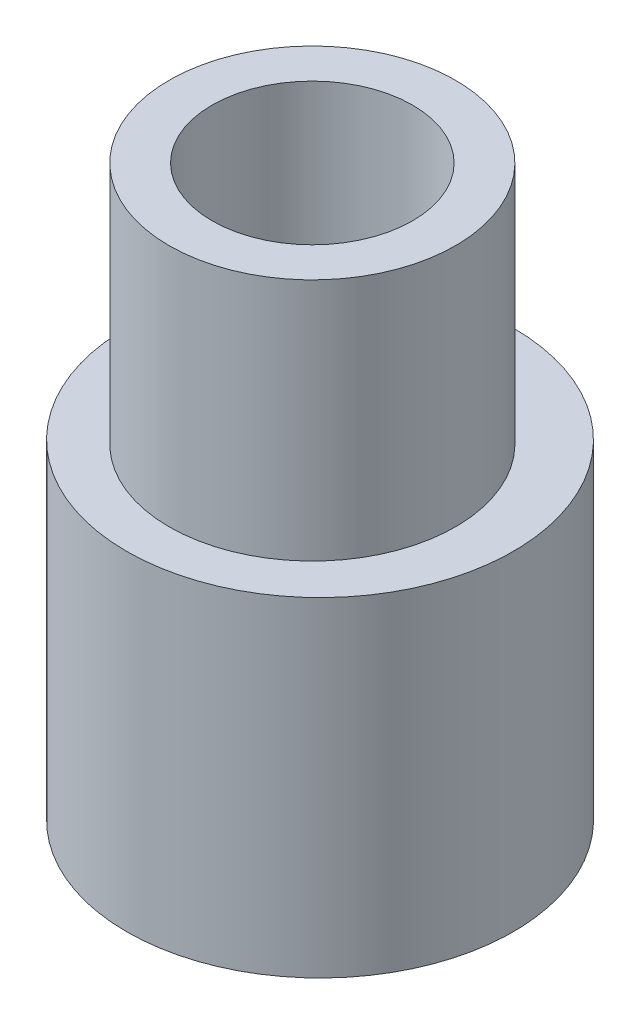
ISO-10303-21;
HEADER;
FILE_DESCRIPTION(('STEP AP214'),'2;1');
FILE_NAME('part.step','',(''),(''),'','','');
FILE_SCHEMA(('AUTOMOTIVE_DESIGN { 1 0 10303 214 1 1 1 1 }'));
ENDSEC;
DATA;
#1=APPLICATION_CONTEXT('core data for automotive mechanical design processes');
#2=APPLICATION_PROTOCOL_DEFINITION('international standard','automotive_design',2000,#1);
#3=PRODUCT_CONTEXT('',#1,'mechanical');
#4=PRODUCT('Part','Part','',(#3));
#5=PRODUCT_RELATED_PRODUCT_CATEGORY('part','',(#4));
#6=PRODUCT_DEFINITION_FORMATION('','',#4);
#7=PRODUCT_DEFINITION_CONTEXT('part definition',#1,'design');
#8=PRODUCT_DEFINITION('design','',#6,#7);
#9=PRODUCT_DEFINITION_SHAPE('','',#8);
#10=(LENGTH_UNIT() NAMED_UNIT(*) SI_UNIT(.MILLI.,.METRE.));
#11=(NAMED_UNIT(*) PLANE_ANGLE_UNIT() SI_UNIT($,.RADIAN.));
#12=(NAMED_UNIT(*) SI_UNIT($,.STERADIAN.) SOLID_ANGLE_UNIT());
#13=UNCERTAINTY_MEASURE_WITH_UNIT(LENGTH_MEASURE(1.E-05),#10,'distance_accuracy_value','');
#14=(GEOMETRIC_REPRESENTATION_CONTEXT(3) GLOBAL_UNCERTAINTY_ASSIGNED_CONTEXT((#13)) GLOBAL_UNIT_ASSIGNED_CONTEXT((#10,
#11,#12)) REPRESENTATION_CONTEXT('',''));
#15=CARTESIAN_POINT('',(0.,0.,0.));
#16=DIRECTION('',(0.,0.,1.));
#17=DIRECTION('',(1.,0.,0.));
#18=AXIS2_PLACEMENT_3D('',#15,#16,#17);
#19=CARTESIAN_POINT('',(0.,4.318,0.));
#20=DIRECTION('',(0.,-1.,0.));
#21=DIRECTION('',(0.,0.,-1.));
#22=AXIS2_PLACEMENT_3D('',#19,#20,#21);
#23=CYLINDRICAL_SURFACE('',#22,2.54);
#24=CARTESIAN_POINT('',(0.,4.318,0.));
#25=DIRECTION('',(0.,1.,0.));
#26=DIRECTION('',(0.,0.,1.));
#27=AXIS2_PLACEMENT_3D('',#24,#25,#26);
#28=CIRCLE('',#27,2.54);
#29=CARTESIAN_POINT('',(0.,4.318,2.54));
#30=VERTEX_POINT('',#29);
#31=EDGE_CURVE('E10',#30,#30,#28,.T.);
#32=ORIENTED_EDGE('',*,*,#31,.F.);
#33=EDGE_LOOP('',(#32));
#34=FACE_BOUND('',#33,.T.);
#35=CARTESIAN_POINT('',(0.,0.,0.));
#36=DIRECTION('',(0.,1.,0.));
#37=DIRECTION('',(0.,0.,1.));
#38=AXIS2_PLACEMENT_3D('',#35,#36,#37);
#39=CIRCLE('',#38,2.54);
#40=CARTESIAN_POINT('',(0.,0.,2.54));
#41=VERTEX_POINT('',#40);
#42=EDGE_CURVE('E40',#41,#41,#39,.T.);
#43=ORIENTED_EDGE('',*,*,#42,.T.);
#44=EDGE_LOOP('',(#43));
#45=FACE_BOUND('',#44,.T.);
#46=ADVANCED_FACE('F37',(#34,#45),#23,.T.);
#47=CARTESIAN_POINT('',(0.,4.318,0.));
#48=DIRECTION('',(0.,1.,0.));
#49=DIRECTION('',(0.,0.,1.));
#50=AXIS2_PLACEMENT_3D('',#47,#48,#49);
#51=PLANE('',#50);
#52=CARTESIAN_POINT('',(0.,4.318,0.));
#53=DIRECTION('',(0.,1.,0.));
#54=DIRECTION('',(0.,0.,1.));
#55=AXIS2_PLACEMENT_3D('',#52,#53,#54);
#56=CIRCLE('',#55,1.778);
#57=CARTESIAN_POINT('',(0.,4.318,1.778));
#58=VERTEX_POINT('',#57);
#59=EDGE_CURVE('E50',#58,#58,#56,.T.);
#60=ORIENTED_EDGE('',*,*,#59,.F.);
#61=EDGE_LOOP('',(#60));
#62=FACE_BOUND('',#61,.T.);
#63=ORIENTED_EDGE('',*,*,#31,.T.);
#64=EDGE_LOOP('',(#63));
#65=FACE_BOUND('',#64,.T.);
#66=ADVANCED_FACE('F102',(#62,#65),#51,.T.);
#67=CARTESIAN_POINT('',(0.,1.27,0.));
#68=DIRECTION('',(0.,1.,0.));
#69=DIRECTION('',(0.,0.,1.));
#70=AXIS2_PLACEMENT_3D('',#67,#68,#69);
#71=CYLINDRICAL_SURFACE('',#70,1.778);
#72=CARTESIAN_POINT('',(0.,1.27,0.));
#73=DIRECTION('',(0.,1.,0.));
#74=DIRECTION('',(0.,0.,1.));
#75=AXIS2_PLACEMENT_3D('',#72,#73,#74);
#76=CIRCLE('',#75,1.778);
#77=CARTESIAN_POINT('',(0.,1.27,1.778));
#78=VERTEX_POINT('',#77);
#79=EDGE_CURVE('E45',#78,#78,#76,.T.);
#80=CARTESIAN_POINT('',(0.,1.27,1.778));
#81=CARTESIAN_POINT('',(0.,1.30175,1.778));
#82=CARTESIAN_POINT('',(0.,1.3335,1.778));
#83=CARTESIAN_POINT('',(0.,1.397,1.778));
#84=CARTESIAN_POINT('',(0.,1.42875,1.778));
#85=CARTESIAN_POINT('',(0.,1.49225,1.778));
#86=CARTESIAN_POINT('',(0.,1.524,1.778));
#87=CARTESIAN_POINT('',(0.,1.5875,1.778));
#88=CARTESIAN_POINT('',(0.,1.61925,1.778));
#89=CARTESIAN_POINT('',(0.,1.68275,1.778));
#90=CARTESIAN_POINT('',(0.,1.7145,1.778));
#91=CARTESIAN_POINT('',(0.,1.778,1.778));
#92=CARTESIAN_POINT('',(0.,1.80975,1.778));
#93=CARTESIAN_POINT('',(0.,1.87325,1.778));
#94=CARTESIAN_POINT('',(0.,1.905,1.778));
#95=CARTESIAN_POINT('',(0.,1.9685,1.778));
#96=CARTESIAN_POINT('',(0.,2.00025,1.778));
#97=CARTESIAN_POINT('',(0.,2.06375,1.778));
#98=CARTESIAN_POINT('',(0.,2.0955,1.778));
#99=CARTESIAN_POINT('',(0.,2.159,1.778));
#100=CARTESIAN_POINT('',(0.,2.19075,1.778));
#101=CARTESIAN_POINT('',(0.,2.25425,1.778));
#102=CARTESIAN_POINT('',(0.,2.286,1.778));
#103=CARTESIAN_POINT('',(0.,2.3495,1.778));
#104=CARTESIAN_POINT('',(0.,2.38125,1.778));
#105=CARTESIAN_POINT('',(0.,2.44475,1.778));
#106=CARTESIAN_POINT('',(0.,2.4765,1.778));
#107=CARTESIAN_POINT('',(0.,2.54,1.778));
#108=CARTESIAN_POINT('',(0.,2.57175,1.778));
#109=CARTESIAN_POINT('',(0.,2.63525,1.778));
#110=CARTESIAN_POINT('',(0.,2.667,1.778));
#111=CARTESIAN_POINT('',(0.,2.7305,1.778));
#112=CARTESIAN_POINT('',(0.,2.76225,1.778));
#113=CARTESIAN_POINT('',(0.,2.82575,1.778));
#114=CARTESIAN_POINT('',(0.,2.8575,1.778));
#115=CARTESIAN_POINT('',(0.,2.921,1.778));
#116=CARTESIAN_POINT('',(0.,2.95275,1.778));
#117=CARTESIAN_POINT('',(0.,3.01625,1.778));
#118=CARTESIAN_POINT('',(0.,3.048,1.778));
#119=CARTESIAN_POINT('',(0.,3.1115,1.778));
#120=CARTESIAN_POINT('',(0.,3.14325,1.778));
#121=CARTESIAN_POINT('',(0.,3.20675,1.778));
#122=CARTESIAN_POINT('',(0.,3.2385,1.778));
#123=CARTESIAN_POINT('',(0.,3.302,1.778));
#124=CARTESIAN_POINT('',(0.,3.33375,1.778));
#125=CARTESIAN_POINT('',(0.,3.39725,1.778));
#126=CARTESIAN_POINT('',(0.,3.429,1.778));
#127=CARTESIAN_POINT('',(0.,3.4925,1.778));
#128=CARTESIAN_POINT('',(0.,3.52425,1.778));
#129=CARTESIAN_POINT('',(0.,3.58775,1.778));
#130=CARTESIAN_POINT('',(0.,3.6195,1.778));
#131=CARTESIAN_POINT('',(0.,3.683,1.778));
#132=CARTESIAN_POINT('',(0.,3.71475,1.778));
#133=CARTESIAN_POINT('',(0.,3.77825,1.778));
#134=CARTESIAN_POINT('',(0.,3.81,1.778));
#135=CARTESIAN_POINT('',(0.,3.8735,1.778));
#136=CARTESIAN_POINT('',(0.,3.90525,1.778));
#137=CARTESIAN_POINT('',(0.,3.96875,1.778));
#138=CARTESIAN_POINT('',(0.,4.0005,1.778));
#139=CARTESIAN_POINT('',(0.,4.064,1.778));
#140=CARTESIAN_POINT('',(0.,4.09575,1.778));
#141=CARTESIAN_POINT('',(0.,4.15925,1.778));
#142=CARTESIAN_POINT('',(0.,4.191,1.778));
#143=CARTESIAN_POINT('',(0.,4.2545,1.778));
#144=CARTESIAN_POINT('',(0.,4.28625,1.778));
#145=CARTESIAN_POINT('',(0.,4.318,1.778));
#146=B_SPLINE_CURVE_WITH_KNOTS('',3,(#80,#81,#82,#83,#84,#85,#86,#87,#88,#89,#90,#91,#92,#93,
#94,#95,#96,#97,#98,#99,#100,#101,#102,#103,#104,#105,#106,#107,#108,#109,#110,#111,#112,#113,
#114,#115,#116,#117,#118,#119,#120,#121,#122,#123,#124,#125,#126,#127,#128,#129,#130,#131,#132,
#133,#134,#135,#136,#137,#138,#139,#140,#141,#142,#143,#144,#145),.UNSPECIFIED.,.F.,.F.,(4,2,2,
2,2,2,2,2,2,2,2,2,2,2,2,2,2,2,2,2,2,2,2,2,2,2,2,2,2,2,2,2,4),(0.,0.0952500000000001,0.1905,
0.28575,0.381,0.47625,0.5715,0.66675,0.762,0.85725,0.9525,1.04775,1.143,1.23825,1.3335,1.42875,
1.524,1.61925,1.7145,1.80975,1.905,2.00025,2.0955,2.19075,2.286,2.38125,2.4765,2.57175,2.667,
2.76225,2.8575,2.95275,3.048),.UNSPECIFIED.);
#147=EDGE_CURVE('BSEAM107',#78,#58,#146,.T.);
#148=ORIENTED_EDGE('',*,*,#79,.F.);
#149=ORIENTED_EDGE('',*,*,#59,.T.);
#150=ORIENTED_EDGE('',*,*,#147,.T.);
#151=ORIENTED_EDGE('',*,*,#147,.F.);
#152=EDGE_LOOP('',(#148,#150,#149,#151));
#153=FACE_BOUND('',#152,.T.);
#154=ADVANCED_FACE('F107',(#153),#71,.F.);
#155=CARTESIAN_POINT('',(0.,1.27,0.));
#156=DIRECTION('',(0.,1.,0.));
#157=DIRECTION('',(0.,0.,1.));
#158=AXIS2_PLACEMENT_3D('',#155,#156,#157);
#159=PLANE('',#158);
#160=ORIENTED_EDGE('',*,*,#79,.T.);
#161=EDGE_LOOP('',(#160));
#162=FACE_BOUND('',#161,.T.);
#163=ADVANCED_FACE('F91',(#162),#159,.T.);
#164=CARTESIAN_POINT('',(0.,-5.842,-0.136069793768456));
#165=DIRECTION('',(0.,1.,0.));
#166=DIRECTION('',(0.,0.,1.));
#167=AXIS2_PLACEMENT_3D('',#164,#165,#166);
#168=CYLINDRICAL_SURFACE('',#167,3.429);
#169=CARTESIAN_POINT('',(0.,-5.842,-0.136069793768456));
#170=DIRECTION('',(0.,-1.,0.));
#171=DIRECTION('',(0.,0.,-1.));
#172=AXIS2_PLACEMENT_3D('',#169,#170,#171);
#173=CIRCLE('',#172,3.429);
#174=CARTESIAN_POINT('',(0.,-5.842,-3.56506979376846));
#175=VERTEX_POINT('',#174);
#176=EDGE_CURVE('E60',#175,#175,#173,.T.);
#177=ORIENTED_EDGE('',*,*,#176,.F.);
#178=EDGE_LOOP('',(#177));
#179=FACE_BOUND('',#178,.T.);
#180=CARTESIAN_POINT('',(0.,0.,-0.136069793768456));
#181=DIRECTION('',(0.,-1.,0.));
#182=DIRECTION('',(0.,0.,-1.));
#183=AXIS2_PLACEMENT_3D('',#180,#181,#182);
#184=CIRCLE('',#183,3.429);
#185=CARTESIAN_POINT('',(0.,0.,-3.56506979376846));
#186=VERTEX_POINT('',#185);
#187=EDGE_CURVE('E56',#186,#186,#184,.T.);
#188=ORIENTED_EDGE('',*,*,#187,.T.);
#189=EDGE_LOOP('',(#188));
#190=FACE_BOUND('',#189,.T.);
#191=ADVANCED_FACE('F85',(#179,#190),#168,.T.);
#192=CARTESIAN_POINT('',(0.,-5.842,-0.136069793768456));
#193=DIRECTION('',(0.,-1.,0.));
#194=DIRECTION('',(0.,0.,-1.));
#195=AXIS2_PLACEMENT_3D('',#192,#193,#194);
#196=PLANE('',#195);
#197=CARTESIAN_POINT('',(0.,-5.842,0.));
#198=DIRECTION('',(0.,-1.,0.));
#199=DIRECTION('',(0.,0.,-1.));
#200=AXIS2_PLACEMENT_3D('',#197,#198,#199);
#201=CIRCLE('',#200,2.794);
#202=CARTESIAN_POINT('',(0.,-5.842,-2.794));
#203=VERTEX_POINT('',#202);
#204=EDGE_CURVE('E65',#203,#203,#201,.T.);
#205=ORIENTED_EDGE('',*,*,#204,.F.);
#206=EDGE_LOOP('',(#205));
#207=FACE_BOUND('',#206,.T.);
#208=ORIENTED_EDGE('',*,*,#176,.T.);
#209=EDGE_LOOP('',(#208));
#210=FACE_BOUND('',#209,.T.);
#211=ADVANCED_FACE('F82',(#207,#210),#196,.T.);
#212=CARTESIAN_POINT('',(0.,0.,-0.136069793768456));
#213=DIRECTION('',(0.,-1.,0.));
#214=DIRECTION('',(0.,0.,-1.));
#215=AXIS2_PLACEMENT_3D('',#212,#213,#214);
#216=PLANE('',#215);
#217=ORIENTED_EDGE('',*,*,#42,.F.);
#218=EDGE_LOOP('',(#217));
#219=FACE_BOUND('',#218,.T.);
#220=ORIENTED_EDGE('',*,*,#187,.F.);
#221=EDGE_LOOP('',(#220));
#222=FACE_BOUND('',#221,.T.);
#223=ADVANCED_FACE('F78',(#219,#222),#216,.F.);
#224=CARTESIAN_POINT('',(0.,-1.016,0.));
#225=DIRECTION('',(0.,-1.,0.));
#226=DIRECTION('',(0.,0.,-1.));
#227=AXIS2_PLACEMENT_3D('',#224,#225,#226);
#228=CYLINDRICAL_SURFACE('',#227,2.794);
#229=CARTESIAN_POINT('',(0.,-1.016,0.));
#230=DIRECTION('',(0.,-1.,0.));
#231=DIRECTION('',(0.,0.,-1.));
#232=AXIS2_PLACEMENT_3D('',#229,#230,#231);
#233=CIRCLE('',#232,2.794);
#234=CARTESIAN_POINT('',(0.,-1.016,-2.794));
#235=VERTEX_POINT('',#234);
#236=EDGE_CURVE('E61',#235,#235,#233,.T.);
#237=ORIENTED_EDGE('',*,*,#236,.F.);
#238=EDGE_LOOP('',(#237));
#239=FACE_BOUND('',#238,.T.);
#240=ORIENTED_EDGE('',*,*,#204,.T.);
#241=EDGE_LOOP('',(#240));
#242=FACE_BOUND('',#241,.T.);
#243=ADVANCED_FACE('F75',(#239,#242),#228,.F.);
#244=CARTESIAN_POINT('',(0.,-1.016,0.));
#245=DIRECTION('',(0.,-1.,0.));
#246=DIRECTION('',(0.,0.,-1.));
#247=AXIS2_PLACEMENT_3D('',#244,#245,#246);
#248=PLANE('',#247);
#249=ORIENTED_EDGE('',*,*,#236,.T.);
#250=EDGE_LOOP('',(#249));
#251=FACE_BOUND('',#250,.T.);
#252=ADVANCED_FACE('F73',(#251),#248,.T.);
#253=CLOSED_SHELL('',(#46,#66,#154,#163,#191,#211,#223,#243,#252));
#254=MANIFOLD_SOLID_BREP('B2',#253);
#255=ADVANCED_BREP_SHAPE_REPRESENTATION('',(#18,#254),#14);
#256=SHAPE_DEFINITION_REPRESENTATION(#9,#255);
ENDSEC;
END-ISO-10303-21;
